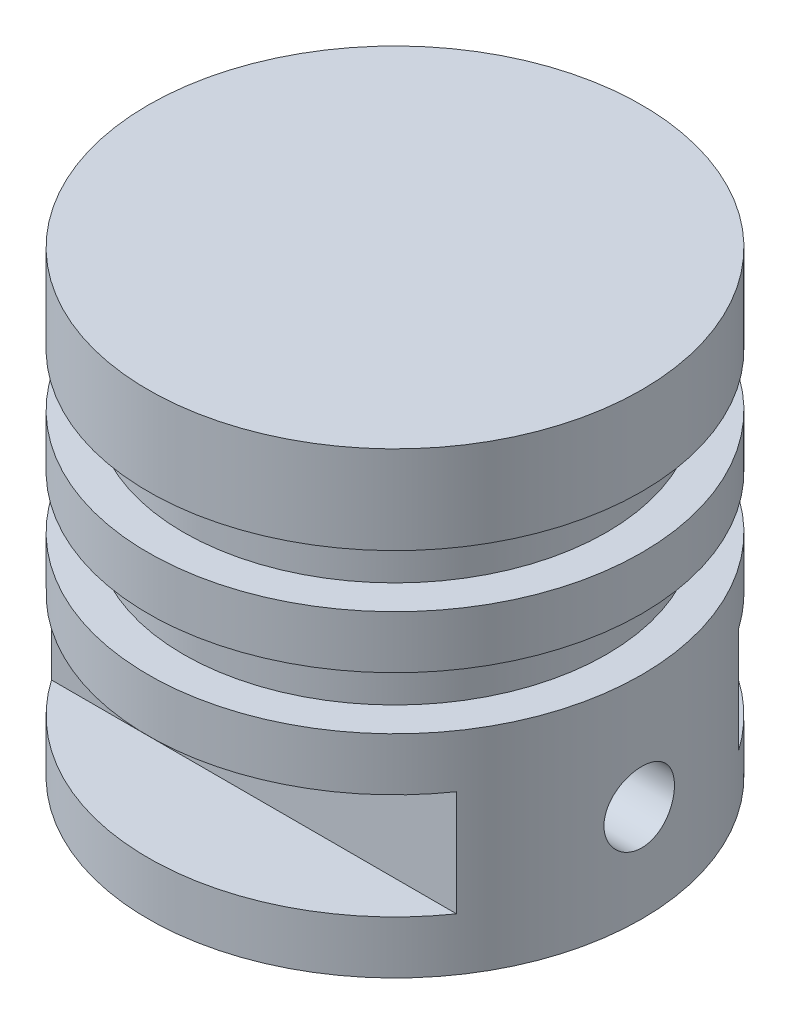
ISO-10303-21;
HEADER;
FILE_DESCRIPTION(('STEP AP214'),'2;1');
FILE_NAME('part.step','',(''),(''),'','','');
FILE_SCHEMA(('AUTOMOTIVE_DESIGN { 1 0 10303 214 1 1 1 1 }'));
ENDSEC;
DATA;
#1=APPLICATION_CONTEXT('core data for automotive mechanical design processes');
#2=APPLICATION_PROTOCOL_DEFINITION('international standard','automotive_design',2000,#1);
#3=PRODUCT_CONTEXT('',#1,'mechanical');
#4=PRODUCT('Part','Part','',(#3));
#5=PRODUCT_RELATED_PRODUCT_CATEGORY('part','',(#4));
#6=PRODUCT_DEFINITION_FORMATION('','',#4);
#7=PRODUCT_DEFINITION_CONTEXT('part definition',#1,'design');
#8=PRODUCT_DEFINITION('design','',#6,#7);
#9=PRODUCT_DEFINITION_SHAPE('','',#8);
#10=(LENGTH_UNIT() NAMED_UNIT(*) SI_UNIT(.MILLI.,.METRE.));
#11=(NAMED_UNIT(*) PLANE_ANGLE_UNIT() SI_UNIT($,.RADIAN.));
#12=(NAMED_UNIT(*) SI_UNIT($,.STERADIAN.) SOLID_ANGLE_UNIT());
#13=UNCERTAINTY_MEASURE_WITH_UNIT(LENGTH_MEASURE(1.E-05),#10,'distance_accuracy_value','');
#14=(GEOMETRIC_REPRESENTATION_CONTEXT(3) GLOBAL_UNCERTAINTY_ASSIGNED_CONTEXT((#13)) GLOBAL_UNIT_ASSIGNED_CONTEXT((#10,
#11,#12)) REPRESENTATION_CONTEXT('',''));
#15=CARTESIAN_POINT('',(0.,0.,0.));
#16=DIRECTION('',(0.,0.,1.));
#17=DIRECTION('',(1.,0.,0.));
#18=AXIS2_PLACEMENT_3D('',#15,#16,#17);
#19=CARTESIAN_POINT('',(0.,13.,0.));
#20=DIRECTION('',(0.,-1.,0.));
#21=DIRECTION('',(-1.,0.,0.));
#22=AXIS2_PLACEMENT_3D('',#19,#20,#21);
#23=CYLINDRICAL_SURFACE('',#22,7.);
#24=DIRECTION('',(0.,1.,0.));
#25=VECTOR('',#24,1.);
#26=CARTESIAN_POINT('',(7.,13.,0.));
#27=LINE('',#26,#25);
#28=CARTESIAN_POINT('',(7.,7.5,0.));
#29=VERTEX_POINT('',#28);
#30=CARTESIAN_POINT('',(7.,9.,0.));
#31=VERTEX_POINT('',#30);
#32=EDGE_CURVE('E149',#29,#31,#27,.T.);
#33=ORIENTED_EDGE('',*,*,#32,.T.);
#34=CARTESIAN_POINT('',(0.,9.,0.));
#35=DIRECTION('',(0.,1.,0.));
#36=DIRECTION('',(0.,0.,1.));
#37=AXIS2_PLACEMENT_3D('',#34,#35,#36);
#38=CIRCLE('',#37,7.);
#39=EDGE_CURVE('E231',#31,#31,#38,.T.);
#40=ORIENTED_EDGE('',*,*,#39,.F.);
#41=ORIENTED_EDGE('',*,*,#32,.F.);
#42=CARTESIAN_POINT('',(0.,7.5,0.));
#43=DIRECTION('',(0.,-1.,0.));
#44=DIRECTION('',(-1.,0.,0.));
#45=AXIS2_PLACEMENT_3D('',#42,#43,#44);
#46=CIRCLE('',#45,7.);
#47=EDGE_CURVE('E171',#29,#29,#46,.T.);
#48=ORIENTED_EDGE('',*,*,#47,.F.);
#49=EDGE_LOOP('',(#33,#40,#41,#48));
#50=FACE_BOUND('',#49,.T.);
#51=ADVANCED_FACE('F40',(#50),#23,.T.);
#52=CARTESIAN_POINT('',(0.,0.,0.));
#53=DIRECTION('',(0.,1.,0.));
#54=DIRECTION('',(1.,0.,0.));
#55=AXIS2_PLACEMENT_3D('',#52,#53,#54);
#56=PLANE('',#55);
#57=DIRECTION('',(0.,0.,1.));
#58=VECTOR('',#57,1.);
#59=CARTESIAN_POINT('',(0.95,0.,0.));
#60=LINE('',#59,#58);
#61=CARTESIAN_POINT('',(0.95,0.,-1.22474487139159));
#62=VERTEX_POINT('',#61);
#63=CARTESIAN_POINT('',(0.95,0.,1.22474487139159));
#64=VERTEX_POINT('',#63);
#65=EDGE_CURVE('E139',#62,#64,#60,.T.);
#66=ORIENTED_EDGE('',*,*,#65,.F.);
#67=CARTESIAN_POINT('',(0.,0.,0.));
#68=DIRECTION('',(0.,-1.,0.));
#69=DIRECTION('',(0.612903225806451,0.,-0.790157981542961));
#70=AXIS2_PLACEMENT_3D('',#67,#68,#69);
#71=CIRCLE('',#70,1.55);
#72=EDGE_CURVE('E131',#64,#62,#71,.T.);
#73=ORIENTED_EDGE('',*,*,#72,.F.);
#74=EDGE_LOOP('',(#66,#73));
#75=FACE_BOUND('',#74,.T.);
#76=CARTESIAN_POINT('',(0.,0.,0.));
#77=DIRECTION('',(0.,1.,0.));
#78=DIRECTION('',(1.,0.,0.));
#79=AXIS2_PLACEMENT_3D('',#76,#77,#78);
#80=CIRCLE('',#79,7.);
#81=CARTESIAN_POINT('',(-7.,0.,0.));
#82=VERTEX_POINT('',#81);
#83=EDGE_CURVE('E147',#82,#82,#80,.T.);
#84=ORIENTED_EDGE('',*,*,#83,.F.);
#85=EDGE_LOOP('',(#84));
#86=FACE_BOUND('',#85,.T.);
#87=ADVANCED_FACE('F198',(#75,#86),#56,.F.);
#88=CARTESIAN_POINT('',(0.,13.,0.));
#89=DIRECTION('',(0.,1.,0.));
#90=DIRECTION('',(1.,0.,0.));
#91=AXIS2_PLACEMENT_3D('',#88,#89,#90);
#92=PLANE('',#91);
#93=CARTESIAN_POINT('',(0.,13.,0.));
#94=DIRECTION('',(0.,1.,0.));
#95=DIRECTION('',(-1.,0.,0.));
#96=AXIS2_PLACEMENT_3D('',#93,#94,#95);
#97=CIRCLE('',#96,7.);
#98=CARTESIAN_POINT('',(7.,13.,0.));
#99=VERTEX_POINT('',#98);
#100=EDGE_CURVE('E152',#99,#99,#97,.T.);
#101=ORIENTED_EDGE('',*,*,#100,.T.);
#102=EDGE_LOOP('',(#101));
#103=FACE_BOUND('',#102,.T.);
#104=ADVANCED_FACE('F196',(#103),#92,.T.);
#105=CARTESIAN_POINT('',(0.95,0.,-1.22474487139159));
#106=DIRECTION('',(-1.,0.,0.));
#107=DIRECTION('',(0.,0.,1.));
#108=AXIS2_PLACEMENT_3D('',#105,#106,#107);
#109=PLANE('',#108);
#110=CARTESIAN_POINT('',(0.95,2.74871672146221,0.));
#111=DIRECTION('',(-1.,0.,0.));
#112=DIRECTION('',(0.,0.,1.));
#113=AXIS2_PLACEMENT_3D('',#110,#111,#112);
#114=CIRCLE('',#113,1.);
#115=CARTESIAN_POINT('',(0.95,2.74871672146221,1.));
#116=VERTEX_POINT('',#115);
#117=EDGE_CURVE('E180',#116,#116,#114,.T.);
#118=ORIENTED_EDGE('',*,*,#117,.F.);
#119=EDGE_LOOP('',(#118));
#120=FACE_BOUND('',#119,.T.);
#121=ORIENTED_EDGE('',*,*,#65,.T.);
#122=DIRECTION('',(0.,1.,0.));
#123=VECTOR('',#122,1.);
#124=CARTESIAN_POINT('',(0.95,0.,1.22474487139159));
#125=LINE('',#124,#123);
#126=CARTESIAN_POINT('',(0.95,5.,1.22474487139159));
#127=VERTEX_POINT('',#126);
#128=EDGE_CURVE('E136',#64,#127,#125,.T.);
#129=ORIENTED_EDGE('',*,*,#128,.T.);
#130=DIRECTION('',(0.,0.,1.));
#131=VECTOR('',#130,1.);
#132=CARTESIAN_POINT('',(0.95,5.,0.));
#133=LINE('',#132,#131);
#134=CARTESIAN_POINT('',(0.95,5.,-1.22474487139159));
#135=VERTEX_POINT('',#134);
#136=EDGE_CURVE('E134',#135,#127,#133,.T.);
#137=ORIENTED_EDGE('',*,*,#136,.F.);
#138=DIRECTION('',(0.,1.,0.));
#139=VECTOR('',#138,1.);
#140=CARTESIAN_POINT('',(0.95,0.,-1.22474487139159));
#141=LINE('',#140,#139);
#142=EDGE_CURVE('E123',#62,#135,#141,.T.);
#143=ORIENTED_EDGE('',*,*,#142,.F.);
#144=EDGE_LOOP('',(#121,#129,#137,#143));
#145=FACE_BOUND('',#144,.T.);
#146=ADVANCED_FACE('F135',(#120,#145),#109,.T.);
#147=CARTESIAN_POINT('',(0.,0.,0.));
#148=DIRECTION('',(0.,1.,0.));
#149=DIRECTION('',(-1.,0.,0.));
#150=AXIS2_PLACEMENT_3D('',#147,#148,#149);
#151=CYLINDRICAL_SURFACE('',#150,1.55);
#152=ORIENTED_EDGE('',*,*,#72,.T.);
#153=ORIENTED_EDGE('',*,*,#142,.T.);
#154=CARTESIAN_POINT('',(0.,5.,0.));
#155=DIRECTION('',(0.,-1.,0.));
#156=DIRECTION('',(0.612903225806451,0.,-0.790157981542961));
#157=AXIS2_PLACEMENT_3D('',#154,#155,#156);
#158=CIRCLE('',#157,1.55);
#159=EDGE_CURVE('E128',#127,#135,#158,.T.);
#160=ORIENTED_EDGE('',*,*,#159,.F.);
#161=ORIENTED_EDGE('',*,*,#128,.F.);
#162=EDGE_LOOP('',(#152,#153,#160,#161));
#163=FACE_BOUND('',#162,.T.);
#164=ADVANCED_FACE('F125',(#163),#151,.F.);
#165=CARTESIAN_POINT('',(0.,13.,0.));
#166=DIRECTION('',(0.,-1.,0.));
#167=DIRECTION('',(-1.,0.,0.));
#168=AXIS2_PLACEMENT_3D('',#165,#166,#167);
#169=CYLINDRICAL_SURFACE('',#168,6.);
#170=CARTESIAN_POINT('',(0.,7.5,0.));
#171=DIRECTION('',(0.,-1.,0.));
#172=DIRECTION('',(-1.,0.,0.));
#173=AXIS2_PLACEMENT_3D('',#170,#171,#172);
#174=CIRCLE('',#173,6.);
#175=CARTESIAN_POINT('',(6.,7.5,0.));
#176=VERTEX_POINT('',#175);
#177=EDGE_CURVE('E168',#176,#176,#174,.T.);
#178=ORIENTED_EDGE('',*,*,#177,.T.);
#179=DIRECTION('',(0.,-1.,0.));
#180=VECTOR('',#179,1.);
#181=CARTESIAN_POINT('',(6.,13.,0.));
#182=LINE('',#181,#180);
#183=CARTESIAN_POINT('',(6.,6.,0.));
#184=VERTEX_POINT('',#183);
#185=EDGE_CURVE('E158',#176,#184,#182,.T.);
#186=ORIENTED_EDGE('',*,*,#185,.T.);
#187=CARTESIAN_POINT('',(0.,6.,0.));
#188=DIRECTION('',(0.,1.,0.));
#189=DIRECTION('',(-1.,0.,0.));
#190=AXIS2_PLACEMENT_3D('',#187,#188,#189);
#191=CIRCLE('',#190,6.);
#192=EDGE_CURVE('E161',#184,#184,#191,.T.);
#193=ORIENTED_EDGE('',*,*,#192,.T.);
#194=ORIENTED_EDGE('',*,*,#185,.F.);
#195=EDGE_LOOP('',(#178,#186,#193,#194));
#196=FACE_BOUND('',#195,.T.);
#197=ADVANCED_FACE('F217',(#196),#169,.T.);
#198=CARTESIAN_POINT('',(0.,10.5,0.));
#199=DIRECTION('',(0.,1.,0.));
#200=DIRECTION('',(0.,0.,1.));
#201=AXIS2_PLACEMENT_3D('',#198,#199,#200);
#202=CIRCLE('',#201,7.);
#203=CARTESIAN_POINT('',(7.,10.5,0.));
#204=VERTEX_POINT('',#203);
#205=EDGE_CURVE('E228',#204,#204,#202,.T.);
#206=ORIENTED_EDGE('',*,*,#205,.T.);
#207=EDGE_CURVE('E153',#204,#99,#27,.T.);
#208=ORIENTED_EDGE('',*,*,#207,.T.);
#209=ORIENTED_EDGE('',*,*,#100,.F.);
#210=ORIENTED_EDGE('',*,*,#207,.F.);
#211=EDGE_LOOP('',(#206,#208,#209,#210));
#212=FACE_BOUND('',#211,.T.);
#213=ADVANCED_FACE('F42',(#212),#23,.T.);
#214=CARTESIAN_POINT('',(0.,8.,0.));
#215=DIRECTION('',(0.,-1.,0.));
#216=DIRECTION('',(-1.,0.,0.));
#217=AXIS2_PLACEMENT_3D('',#214,#215,#216);
#218=CYLINDRICAL_SURFACE('',#217,7.);
#219=CARTESIAN_POINT('',(0.,4.5,0.));
#220=DIRECTION('',(0.,1.,0.));
#221=DIRECTION('',(0.,0.,1.));
#222=AXIS2_PLACEMENT_3D('',#219,#220,#221);
#223=CIRCLE('',#222,7.);
#224=CARTESIAN_POINT('',(-5.74456264653803,4.5,-4.));
#225=VERTEX_POINT('',#224);
#226=CARTESIAN_POINT('',(5.74456264653803,4.5,-4.));
#227=VERTEX_POINT('',#226);
#228=EDGE_CURVE('E11',#225,#227,#223,.F.);
#229=ORIENTED_EDGE('',*,*,#228,.F.);
#230=DIRECTION('',(0.,-1.,0.));
#231=VECTOR('',#230,1.);
#232=CARTESIAN_POINT('',(-5.74456264653803,8.,-4.));
#233=LINE('',#232,#231);
#234=CARTESIAN_POINT('',(-5.74456264653803,1.5,-4.));
#235=VERTEX_POINT('',#234);
#236=EDGE_CURVE('E48',#235,#225,#233,.F.);
#237=ORIENTED_EDGE('',*,*,#236,.F.);
#238=CARTESIAN_POINT('',(0.,1.5,0.));
#239=DIRECTION('',(0.,-1.,0.));
#240=DIRECTION('',(0.,0.,-1.));
#241=AXIS2_PLACEMENT_3D('',#238,#239,#240);
#242=CIRCLE('',#241,7.);
#243=CARTESIAN_POINT('',(5.74456264653803,1.5,-4.));
#244=VERTEX_POINT('',#243);
#245=EDGE_CURVE('E417',#244,#235,#242,.F.);
#246=ORIENTED_EDGE('',*,*,#245,.F.);
#247=DIRECTION('',(0.,-1.,0.));
#248=VECTOR('',#247,1.);
#249=CARTESIAN_POINT('',(5.74456264653803,8.,-4.));
#250=LINE('',#249,#248);
#251=EDGE_CURVE('E420',#227,#244,#250,.T.);
#252=ORIENTED_EDGE('',*,*,#251,.F.);
#253=EDGE_LOOP('',(#229,#237,#246,#252));
#254=FACE_BOUND('',#253,.T.);
#255=DIRECTION('',(0.,-1.,0.));
#256=VECTOR('',#255,1.);
#257=CARTESIAN_POINT('',(5.74456264653803,8.,4.));
#258=LINE('',#257,#256);
#259=CARTESIAN_POINT('',(5.74456264653803,1.5,4.));
#260=VERTEX_POINT('',#259);
#261=CARTESIAN_POINT('',(5.74456264653803,4.5,4.));
#262=VERTEX_POINT('',#261);
#263=EDGE_CURVE('E421',#260,#262,#258,.F.);
#264=ORIENTED_EDGE('',*,*,#263,.F.);
#265=CARTESIAN_POINT('',(0.,1.5,0.));
#266=DIRECTION('',(0.,-1.,0.));
#267=DIRECTION('',(0.,0.,-1.));
#268=AXIS2_PLACEMENT_3D('',#265,#266,#267);
#269=CIRCLE('',#268,7.);
#270=CARTESIAN_POINT('',(-5.74456264653803,1.5,4.));
#271=VERTEX_POINT('',#270);
#272=EDGE_CURVE('E434',#271,#260,#269,.F.);
#273=ORIENTED_EDGE('',*,*,#272,.F.);
#274=DIRECTION('',(0.,-1.,0.));
#275=VECTOR('',#274,1.);
#276=CARTESIAN_POINT('',(-5.74456264653803,8.,4.));
#277=LINE('',#276,#275);
#278=CARTESIAN_POINT('',(-5.74456264653803,4.5,4.));
#279=VERTEX_POINT('',#278);
#280=EDGE_CURVE('E155',#279,#271,#277,.T.);
#281=ORIENTED_EDGE('',*,*,#280,.F.);
#282=CARTESIAN_POINT('',(0.,4.5,0.));
#283=DIRECTION('',(0.,1.,0.));
#284=DIRECTION('',(0.,0.,1.));
#285=AXIS2_PLACEMENT_3D('',#282,#283,#284);
#286=CIRCLE('',#285,7.);
#287=EDGE_CURVE('E433',#262,#279,#286,.F.);
#288=ORIENTED_EDGE('',*,*,#287,.F.);
#289=EDGE_LOOP('',(#264,#273,#281,#288));
#290=FACE_BOUND('',#289,.T.);
#291=CARTESIAN_POINT('',(6.92820323027551,2.74871672146221,1.));
#292=CARTESIAN_POINT('',(6.928204128687,2.69285463584657,0.999997670580239));
#293=CARTESIAN_POINT('',(6.92888616041897,2.63695936508963,0.995303322536939));
#294=CARTESIAN_POINT('',(6.93153899622431,2.52672940326321,0.976653700691919));
#295=CARTESIAN_POINT('',(6.93351108456814,2.47239632370716,0.962689198108791));
#296=CARTESIAN_POINT('',(6.93851621306341,2.36690237144333,0.925923694181395));
#297=CARTESIAN_POINT('',(6.941548467497,2.31573918241076,0.903129235610145));
#298=CARTESIAN_POINT('',(6.94833133303147,2.21797185672938,0.849365879446309));
#299=CARTESIAN_POINT('',(6.95208183798356,2.17136704794239,0.818398189503692));
#300=CARTESIAN_POINT('',(6.95990912626669,2.08369257353823,0.748926734200914));
#301=CARTESIAN_POINT('',(6.96398787236068,2.04266086452918,0.710375282136629));
#302=CARTESIAN_POINT('',(6.97199451559518,1.96762594284201,0.626933539483592));
#303=CARTESIAN_POINT('',(6.97592240467862,1.9336231051421,0.582042910925569));
#304=CARTESIAN_POINT('',(6.98320518511365,1.87347217258235,0.486955192010242));
#305=CARTESIAN_POINT('',(6.98655751146715,1.84735886420299,0.436735883108046));
#306=CARTESIAN_POINT('',(6.99228975726475,1.80395135379831,0.332568372981551));
#307=CARTESIAN_POINT('',(6.99466972341828,1.78665672813852,0.278620351019666));
#308=CARTESIAN_POINT('',(6.99817525004484,1.76149211798008,0.168917031770476));
#309=CARTESIAN_POINT('',(6.99930925159054,1.7535586864791,0.11317656253494));
#310=CARTESIAN_POINT('',(7.00022397741917,1.74714477217892,0.00114478263920042));
#311=CARTESIAN_POINT('',(7.00000477026116,1.74866381047916,-0.0551464999702886));
#312=CARTESIAN_POINT('',(6.99824454731631,1.76106141057012,-0.166249496092934));
#313=CARTESIAN_POINT('',(6.99671317066214,1.77187172090347,-0.221068999885517));
#314=CARTESIAN_POINT('',(6.99251142706317,1.80243800131182,-0.328107797564346));
#315=CARTESIAN_POINT('',(6.98984103305346,1.82219418395611,-0.380327029630941));
#316=CARTESIAN_POINT('',(6.98364470185491,1.870162093854,-0.480890983383868));
#317=CARTESIAN_POINT('',(6.98011584085856,1.89840279702163,-0.529221696395533));
#318=CARTESIAN_POINT('',(6.97259633348114,1.96251696783235,-0.620483910068822));
#319=CARTESIAN_POINT('',(6.96860565949974,1.99839089178382,-0.663415087705914));
#320=CARTESIAN_POINT('',(6.96056602471901,2.07713402230021,-0.743061495531929));
#321=CARTESIAN_POINT('',(6.95651686155615,2.12006278783681,-0.779717846660918));
#322=CARTESIAN_POINT('',(6.94885146937832,2.21149398217696,-0.845314947950616));
#323=CARTESIAN_POINT('',(6.94523524258153,2.25999643953502,-0.874255658580892));
#324=CARTESIAN_POINT('',(6.93884526841462,2.3612568664153,-0.923606507603973));
#325=CARTESIAN_POINT('',(6.93607207884933,2.41401762440352,-0.94401100125889));
#326=CARTESIAN_POINT('',(6.93169232904474,2.52226551137516,-0.975653118541601));
#327=CARTESIAN_POINT('',(6.93008569458064,2.577752466658,-0.986891325401512));
#328=CARTESIAN_POINT('',(6.92823490378659,2.68935499017723,-0.999801953440968));
#329=CARTESIAN_POINT('',(6.92797888601553,2.74546073446001,-1.00155765552236));
#330=CARTESIAN_POINT('',(6.92882686266357,2.85716562397479,-0.995674041235602));
#331=CARTESIAN_POINT('',(6.92993081893156,2.91276478337386,-0.98803498841685));
#332=CARTESIAN_POINT('',(6.93336348262582,3.02162281147644,-0.963649189276007));
#333=CARTESIAN_POINT('',(6.93568665672625,3.07489108499488,-0.946943579222102));
#334=CARTESIAN_POINT('',(6.94129145606085,3.17787112019046,-0.904941530857316));
#335=CARTESIAN_POINT('',(6.94457312454805,3.22758272124308,-0.879644704850705));
#336=CARTESIAN_POINT('',(6.95175324206709,3.32241266132296,-0.820976801656127));
#337=CARTESIAN_POINT('',(6.95565576226152,3.36749720206839,-0.787551600135623));
#338=CARTESIAN_POINT('',(6.96362545432963,3.45144658327497,-0.713651389106822));
#339=CARTESIAN_POINT('',(6.96769263461473,3.49031110549178,-0.673176019101081));
#340=CARTESIAN_POINT('',(6.97557026206955,3.56101433067911,-0.585958543142675));
#341=CARTESIAN_POINT('',(6.97937854780926,3.59279798262198,-0.539171586062163));
#342=CARTESIAN_POINT('',(6.98627610779902,3.64805450303008,-0.440874352385596));
#343=CARTESIAN_POINT('',(6.98936540020244,3.67152758133119,-0.389364195088227));
#344=CARTESIAN_POINT('',(6.99446738922221,3.70940777862007,-0.283257962296965));
#345=CARTESIAN_POINT('',(6.99648371828611,3.72384551577596,-0.228672999561963));
#346=CARTESIAN_POINT('',(6.99922779558263,3.74334445501552,-0.117822629522891));
#347=CARTESIAN_POINT('',(6.99995562067618,3.74840621638914,-0.061557322657138));
#348=CARTESIAN_POINT('',(7.00004003835958,3.74899684093445,0.0505215653135793));
#349=CARTESIAN_POINT('',(6.99940877511198,3.74461013097143,0.106334710875293));
#350=CARTESIAN_POINT('',(6.99687032137522,3.7266086464407,0.216421316739936));
#351=CARTESIAN_POINT('',(6.99496313389852,3.71299389366028,0.270694780677722));
#352=CARTESIAN_POINT('',(6.99008611027128,3.67695173274812,0.376141857248626));
#353=CARTESIAN_POINT('',(6.98711691409834,3.65452963121985,0.427317315103493));
#354=CARTESIAN_POINT('',(6.98044280051146,3.6015181468612,0.525192852925742));
#355=CARTESIAN_POINT('',(6.97673786372185,3.57092854893316,0.571892814983277));
#356=CARTESIAN_POINT('',(6.96896523731735,3.50214286385053,0.659920974801326));
#357=CARTESIAN_POINT('',(6.96489472929535,3.46388426804597,0.701200083159929));
#358=CARTESIAN_POINT('',(6.95687111713085,3.38097794134456,0.776783583636216));
#359=CARTESIAN_POINT('',(6.95291804082458,3.33632870996394,0.81108633315365));
#360=CARTESIAN_POINT('',(6.94555543925944,3.2416440022944,0.871897617377967));
#361=CARTESIAN_POINT('',(6.94214877013918,3.1915823762567,0.898365771504987));
#362=CARTESIAN_POINT('',(6.93629814067689,3.08770057315991,0.942479512535467));
#363=CARTESIAN_POINT('',(6.93385316718016,3.03388442230345,0.960134389610678));
#364=CARTESIAN_POINT('',(6.93077646109593,2.94129850854707,0.982046275827905));
#365=CARTESIAN_POINT('',(6.92981651997027,2.90310455375732,0.988768812647753));
#366=CARTESIAN_POINT('',(6.92852959655824,2.82618462297892,0.997746457542627));
#367=CARTESIAN_POINT('',(6.92820260720181,2.78745865293775,1.00000161551829));
#368=CARTESIAN_POINT('',(6.92820323027551,2.74871672146221,1.));
#369=B_SPLINE_CURVE_WITH_KNOTS('',3,(#291,#292,#293,#294,#295,#296,#297,#298,#299,#300,#301,
#302,#303,#304,#305,#306,#307,#308,#309,#310,#311,#312,#313,#314,#315,#316,#317,#318,#319,#320,
#321,#322,#323,#324,#325,#326,#327,#328,#329,#330,#331,#332,#333,#334,#335,#336,#337,#338,#339,
#340,#341,#342,#343,#344,#345,#346,#347,#348,#349,#350,#351,#352,#353,#354,#355,#356,#357,#358,
#359,#360,#361,#362,#363,#364,#365,#366,#367,#368),.UNSPECIFIED.,.T.,.F.,(4,2,2,2,2,2,2,2,2,2,2,
2,2,2,2,2,2,2,2,2,2,2,2,2,2,2,2,2,2,2,2,2,2,2,2,2,2,2,4),(0.,0.167444674697946,0.33505629725044,
0.502543960684091,0.670006890528837,0.838558578232398,1.00711925555999,1.17641265336732,
1.3456979178424,1.51382911068039,1.6819517853778,1.84884992452451,2.01575202966586,
2.18323073819423,2.3507194612925,2.51970258991851,2.68868658429869,2.85778214664265,
3.02686694894168,3.1944643054001,3.36205696038683,3.52889550400879,3.69574157755292,
3.86373060504462,4.0317282248703,4.20098960759813,4.37024671629559,4.53892711068184,
4.70759744272481,4.87476687650763,5.0419359156068,5.20900438614292,5.37607725699724,
5.54457174653061,5.71310586267878,5.88249407755997,6.05170335943179,6.1678322598134,
6.28395986302758),.UNSPECIFIED.);
#370=CARTESIAN_POINT('',(7.,3.74871672146221,0.));
#371=VERTEX_POINT('',#370);
#372=EDGE_CURVE('E173',#371,#371,#369,.T.);
#373=ORIENTED_EDGE('',*,*,#372,.F.);
#374=DIRECTION('',(0.,1.,0.));
#375=VECTOR('',#374,1.);
#376=CARTESIAN_POINT('',(7.,8.,0.));
#377=LINE('',#376,#375);
#378=CARTESIAN_POINT('',(7.,6.,0.));
#379=VERTEX_POINT('',#378);
#380=EDGE_CURVE('E164',#371,#379,#377,.T.);
#381=ORIENTED_EDGE('',*,*,#380,.T.);
#382=CARTESIAN_POINT('',(0.,6.,0.));
#383=DIRECTION('',(0.,-1.,0.));
#384=DIRECTION('',(-1.,0.,0.));
#385=AXIS2_PLACEMENT_3D('',#382,#383,#384);
#386=CIRCLE('',#385,7.);
#387=EDGE_CURVE('E165',#379,#379,#386,.T.);
#388=ORIENTED_EDGE('',*,*,#387,.T.);
#389=ORIENTED_EDGE('',*,*,#380,.F.);
#390=EDGE_LOOP('',(#373,#381,#388,#389));
#391=FACE_BOUND('',#390,.T.);
#392=DIRECTION('',(0.,-1.,0.));
#393=VECTOR('',#392,1.);
#394=CARTESIAN_POINT('',(-7.,0.,0.));
#395=LINE('',#394,#393);
#396=CARTESIAN_POINT('',(-7.,2.,0.));
#397=VERTEX_POINT('',#396);
#398=EDGE_CURVE('E138',#397,#82,#395,.T.);
#399=ORIENTED_EDGE('',*,*,#398,.F.);
#400=ORIENTED_EDGE('',*,*,#398,.T.);
#401=ORIENTED_EDGE('',*,*,#83,.T.);
#402=EDGE_LOOP('',(#399,#400,#401));
#403=FACE_BOUND('',#402,.T.);
#404=ADVANCED_FACE('F182',(#254,#290,#391,#403),#218,.T.);
#405=CARTESIAN_POINT('',(0.,6.,0.));
#406=DIRECTION('',(0.,1.,0.));
#407=DIRECTION('',(1.,0.,0.));
#408=AXIS2_PLACEMENT_3D('',#405,#406,#407);
#409=PLANE('',#408);
#410=ORIENTED_EDGE('',*,*,#192,.F.);
#411=EDGE_LOOP('',(#410));
#412=FACE_BOUND('',#411,.T.);
#413=ORIENTED_EDGE('',*,*,#387,.F.);
#414=EDGE_LOOP('',(#413));
#415=FACE_BOUND('',#414,.T.);
#416=ADVANCED_FACE('F201',(#412,#415),#409,.T.);
#417=CARTESIAN_POINT('',(0.,7.5,0.));
#418=DIRECTION('',(0.,1.,0.));
#419=DIRECTION('',(1.,0.,0.));
#420=AXIS2_PLACEMENT_3D('',#417,#418,#419);
#421=PLANE('',#420);
#422=ORIENTED_EDGE('',*,*,#177,.F.);
#423=EDGE_LOOP('',(#422));
#424=FACE_BOUND('',#423,.T.);
#425=ORIENTED_EDGE('',*,*,#47,.T.);
#426=EDGE_LOOP('',(#425));
#427=FACE_BOUND('',#426,.T.);
#428=ADVANCED_FACE('F192',(#424,#427),#421,.F.);
#429=CARTESIAN_POINT('',(10.95,2.74871672146221,0.));
#430=DIRECTION('',(-1.,0.,0.));
#431=DIRECTION('',(0.,0.,1.));
#432=AXIS2_PLACEMENT_3D('',#429,#430,#431);
#433=CYLINDRICAL_SURFACE('',#432,1.);
#434=ORIENTED_EDGE('',*,*,#372,.T.);
#435=EDGE_LOOP('',(#434));
#436=FACE_BOUND('',#435,.T.);
#437=ORIENTED_EDGE('',*,*,#117,.T.);
#438=EDGE_LOOP('',(#437));
#439=FACE_BOUND('',#438,.T.);
#440=ADVANCED_FACE('F186',(#436,#439),#433,.F.);
#441=CARTESIAN_POINT('',(0.,9.,0.));
#442=DIRECTION('',(0.,1.,0.));
#443=DIRECTION('',(0.,0.,1.));
#444=AXIS2_PLACEMENT_3D('',#441,#442,#443);
#445=PLANE('',#444);
#446=CARTESIAN_POINT('',(0.,9.,0.));
#447=DIRECTION('',(0.,1.,0.));
#448=DIRECTION('',(0.,0.,1.));
#449=AXIS2_PLACEMENT_3D('',#446,#447,#448);
#450=CIRCLE('',#449,6.);
#451=CARTESIAN_POINT('',(0.,9.,6.));
#452=VERTEX_POINT('',#451);
#453=EDGE_CURVE('E232',#452,#452,#450,.T.);
#454=ORIENTED_EDGE('',*,*,#453,.F.);
#455=EDGE_LOOP('',(#454));
#456=FACE_BOUND('',#455,.T.);
#457=ORIENTED_EDGE('',*,*,#39,.T.);
#458=EDGE_LOOP('',(#457));
#459=FACE_BOUND('',#458,.T.);
#460=ADVANCED_FACE('F191',(#456,#459),#445,.T.);
#461=CARTESIAN_POINT('',(0.,10.5,0.));
#462=DIRECTION('',(0.,1.,0.));
#463=DIRECTION('',(0.,0.,1.));
#464=AXIS2_PLACEMENT_3D('',#461,#462,#463);
#465=PLANE('',#464);
#466=CARTESIAN_POINT('',(0.,10.5,0.));
#467=DIRECTION('',(0.,1.,0.));
#468=DIRECTION('',(0.,0.,1.));
#469=AXIS2_PLACEMENT_3D('',#466,#467,#468);
#470=CIRCLE('',#469,6.);
#471=CARTESIAN_POINT('',(0.,10.5,6.));
#472=VERTEX_POINT('',#471);
#473=EDGE_CURVE('E236',#472,#472,#470,.T.);
#474=ORIENTED_EDGE('',*,*,#473,.T.);
#475=EDGE_LOOP('',(#474));
#476=FACE_BOUND('',#475,.T.);
#477=ORIENTED_EDGE('',*,*,#205,.F.);
#478=EDGE_LOOP('',(#477));
#479=FACE_BOUND('',#478,.T.);
#480=ADVANCED_FACE('F194',(#476,#479),#465,.F.);
#481=CARTESIAN_POINT('',(0.,9.,0.));
#482=DIRECTION('',(0.,1.,0.));
#483=DIRECTION('',(0.,0.,1.));
#484=AXIS2_PLACEMENT_3D('',#481,#482,#483);
#485=CYLINDRICAL_SURFACE('',#484,6.);
#486=ORIENTED_EDGE('',*,*,#453,.T.);
#487=EDGE_LOOP('',(#486));
#488=FACE_BOUND('',#487,.T.);
#489=ORIENTED_EDGE('',*,*,#473,.F.);
#490=EDGE_LOOP('',(#489));
#491=FACE_BOUND('',#490,.T.);
#492=ADVANCED_FACE('F331',(#488,#491),#485,.T.);
#493=CARTESIAN_POINT('',(7.,4.5,10.790568590718));
#494=DIRECTION('',(0.,1.,0.));
#495=DIRECTION('',(0.,0.,1.));
#496=AXIS2_PLACEMENT_3D('',#493,#494,#495);
#497=PLANE('',#496);
#498=ORIENTED_EDGE('',*,*,#287,.T.);
#499=DIRECTION('',(-1.,0.,0.));
#500=VECTOR('',#499,1.);
#501=CARTESIAN_POINT('',(7.,4.5,4.));
#502=LINE('',#501,#500);
#503=EDGE_CURVE('E62',#262,#279,#502,.T.);
#504=ORIENTED_EDGE('',*,*,#503,.F.);
#505=EDGE_LOOP('',(#498,#504));
#506=FACE_BOUND('',#505,.T.);
#507=ADVANCED_FACE('F338',(#506),#497,.F.);
#508=CARTESIAN_POINT('',(7.,1.5,10.790568590718));
#509=DIRECTION('',(0.,-1.,0.));
#510=DIRECTION('',(0.,0.,-1.));
#511=AXIS2_PLACEMENT_3D('',#508,#509,#510);
#512=PLANE('',#511);
#513=ORIENTED_EDGE('',*,*,#272,.T.);
#514=DIRECTION('',(-1.,0.,0.));
#515=VECTOR('',#514,1.);
#516=CARTESIAN_POINT('',(7.,1.5,4.));
#517=LINE('',#516,#515);
#518=EDGE_CURVE('E426',#260,#271,#517,.T.);
#519=ORIENTED_EDGE('',*,*,#518,.T.);
#520=EDGE_LOOP('',(#513,#519));
#521=FACE_BOUND('',#520,.T.);
#522=ADVANCED_FACE('F346',(#521),#512,.F.);
#523=CARTESIAN_POINT('',(7.,4.5,4.));
#524=DIRECTION('',(0.,0.,-1.));
#525=DIRECTION('',(-1.,0.,0.));
#526=AXIS2_PLACEMENT_3D('',#523,#524,#525);
#527=PLANE('',#526);
#528=ORIENTED_EDGE('',*,*,#263,.T.);
#529=ORIENTED_EDGE('',*,*,#503,.T.);
#530=ORIENTED_EDGE('',*,*,#280,.T.);
#531=ORIENTED_EDGE('',*,*,#518,.F.);
#532=EDGE_LOOP('',(#528,#529,#530,#531));
#533=FACE_BOUND('',#532,.T.);
#534=ADVANCED_FACE('F355',(#533),#527,.F.);
#535=CARTESIAN_POINT('',(7.,4.5,-10.790568590718));
#536=DIRECTION('',(0.,1.,0.));
#537=DIRECTION('',(0.,0.,1.));
#538=AXIS2_PLACEMENT_3D('',#535,#536,#537);
#539=PLANE('',#538);
#540=ORIENTED_EDGE('',*,*,#228,.T.);
#541=DIRECTION('',(-1.,0.,0.));
#542=VECTOR('',#541,1.);
#543=CARTESIAN_POINT('',(7.,4.5,-4.));
#544=LINE('',#543,#542);
#545=EDGE_CURVE('E425',#227,#225,#544,.T.);
#546=ORIENTED_EDGE('',*,*,#545,.T.);
#547=EDGE_LOOP('',(#540,#546));
#548=FACE_BOUND('',#547,.T.);
#549=ADVANCED_FACE('F364',(#548),#539,.F.);
#550=CARTESIAN_POINT('',(7.,4.5,-4.));
#551=DIRECTION('',(0.,0.,1.));
#552=DIRECTION('',(1.,0.,0.));
#553=AXIS2_PLACEMENT_3D('',#550,#551,#552);
#554=PLANE('',#553);
#555=ORIENTED_EDGE('',*,*,#236,.T.);
#556=ORIENTED_EDGE('',*,*,#545,.F.);
#557=ORIENTED_EDGE('',*,*,#251,.T.);
#558=DIRECTION('',(-1.,0.,0.));
#559=VECTOR('',#558,1.);
#560=CARTESIAN_POINT('',(7.,1.5,-4.));
#561=LINE('',#560,#559);
#562=EDGE_CURVE('E54',#244,#235,#561,.T.);
#563=ORIENTED_EDGE('',*,*,#562,.T.);
#564=EDGE_LOOP('',(#555,#556,#557,#563));
#565=FACE_BOUND('',#564,.T.);
#566=ADVANCED_FACE('F372',(#565),#554,.F.);
#567=CARTESIAN_POINT('',(7.,1.5,-10.790568590718));
#568=DIRECTION('',(0.,-1.,0.));
#569=DIRECTION('',(0.,0.,-1.));
#570=AXIS2_PLACEMENT_3D('',#567,#568,#569);
#571=PLANE('',#570);
#572=ORIENTED_EDGE('',*,*,#245,.T.);
#573=ORIENTED_EDGE('',*,*,#562,.F.);
#574=EDGE_LOOP('',(#572,#573));
#575=FACE_BOUND('',#574,.T.);
#576=ADVANCED_FACE('F381',(#575),#571,.F.);
#577=CARTESIAN_POINT('',(0.,5.,0.));
#578=DIRECTION('',(0.,1.,0.));
#579=DIRECTION('',(0.,0.,1.));
#580=AXIS2_PLACEMENT_3D('',#577,#578,#579);
#581=PLANE('',#580);
#582=ORIENTED_EDGE('',*,*,#136,.T.);
#583=ORIENTED_EDGE('',*,*,#159,.T.);
#584=EDGE_LOOP('',(#582,#583));
#585=FACE_BOUND('',#584,.T.);
#586=ADVANCED_FACE('F141',(#585),#581,.F.);
#587=CLOSED_SHELL('',(#51,#87,#104,#146,#164,#197,#213,#404,#416,#428,#440,#460,#480,#492,#507,
#522,#534,#549,#566,#576,#586));
#588=MANIFOLD_SOLID_BREP('B2',#587);
#589=ADVANCED_BREP_SHAPE_REPRESENTATION('',(#18,#588),#14);
#590=SHAPE_DEFINITION_REPRESENTATION(#9,#589);
ENDSEC;
END-ISO-10303-21;
